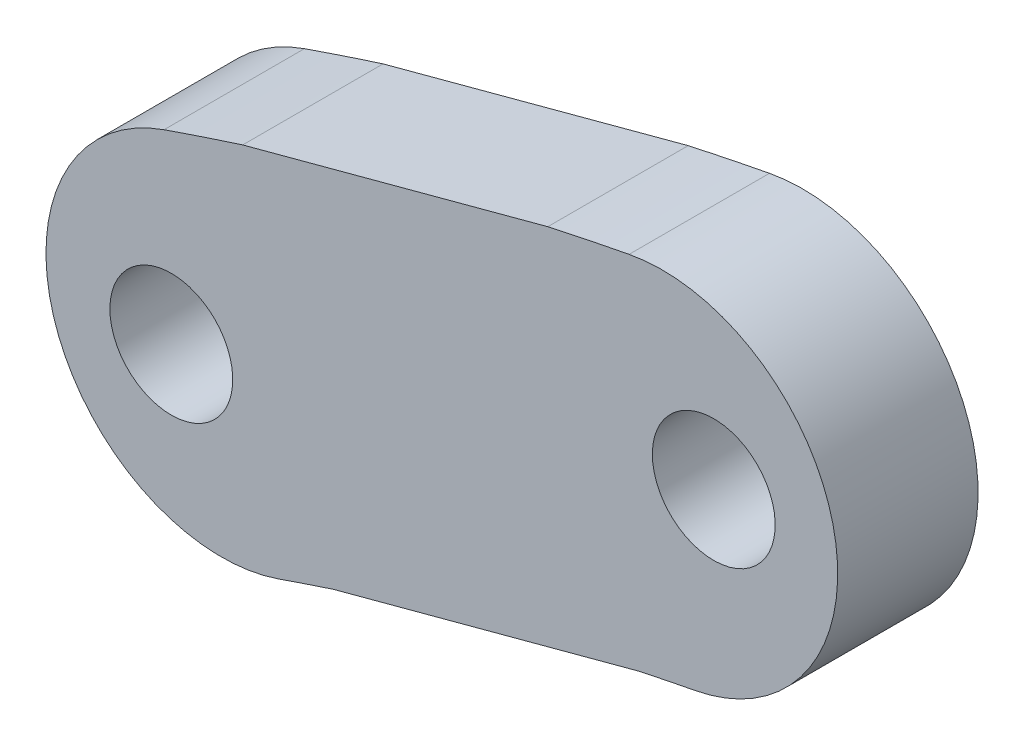
ISO-10303-21;
HEADER;
FILE_DESCRIPTION(('STEP AP214'),'2;1');
FILE_NAME('part.step','',(''),(''),'','','');
FILE_SCHEMA(('AUTOMOTIVE_DESIGN { 1 0 10303 214 1 1 1 1 }'));
ENDSEC;
DATA;
#1=APPLICATION_CONTEXT('core data for automotive mechanical design processes');
#2=APPLICATION_PROTOCOL_DEFINITION('international standard','automotive_design',2000,#1);
#3=PRODUCT_CONTEXT('',#1,'mechanical');
#4=PRODUCT('Part','Part','',(#3));
#5=PRODUCT_RELATED_PRODUCT_CATEGORY('part','',(#4));
#6=PRODUCT_DEFINITION_FORMATION('','',#4);
#7=PRODUCT_DEFINITION_CONTEXT('part definition',#1,'design');
#8=PRODUCT_DEFINITION('design','',#6,#7);
#9=PRODUCT_DEFINITION_SHAPE('','',#8);
#10=(LENGTH_UNIT() NAMED_UNIT(*) SI_UNIT(.MILLI.,.METRE.));
#11=(NAMED_UNIT(*) PLANE_ANGLE_UNIT() SI_UNIT($,.RADIAN.));
#12=(NAMED_UNIT(*) SI_UNIT($,.STERADIAN.) SOLID_ANGLE_UNIT());
#13=UNCERTAINTY_MEASURE_WITH_UNIT(LENGTH_MEASURE(1.E-05),#10,'distance_accuracy_value','');
#14=(GEOMETRIC_REPRESENTATION_CONTEXT(3) GLOBAL_UNCERTAINTY_ASSIGNED_CONTEXT((#13)) GLOBAL_UNIT_ASSIGNED_CONTEXT((#10,
#11,#12)) REPRESENTATION_CONTEXT('',''));
#15=CARTESIAN_POINT('',(0.,0.,0.));
#16=DIRECTION('',(0.,0.,1.));
#17=DIRECTION('',(1.,0.,0.));
#18=AXIS2_PLACEMENT_3D('',#15,#16,#17);
#19=CARTESIAN_POINT('',(-26.4254766264976,81.3053110751052,97.2922710574948));
#20=DIRECTION('',(-0.258819045102521,0.965925826289069,0.));
#21=DIRECTION('',(-0.965925826289069,-0.258819045102521,0.));
#22=AXIS2_PLACEMENT_3D('',#19,#20,#21);
#23=PLANE('',#22);
#24=DIRECTION('',(0.965925826289069,0.258819045102521,0.));
#25=VECTOR('',#24,1.);
#26=CARTESIAN_POINT('',(-26.4254766264976,81.3053110751052,93.2922710574948));
#27=LINE('',#26,#25);
#28=CARTESIAN_POINT('',(-26.4254766264976,81.3053110751052,93.2922710574948));
#29=VERTEX_POINT('',#28);
#30=CARTESIAN_POINT('',(-17.732144189896,83.6346824810279,93.2922710574948));
#31=VERTEX_POINT('',#30);
#32=EDGE_CURVE('E118',#29,#31,#27,.T.);
#33=ORIENTED_EDGE('',*,*,#32,.T.);
#34=DIRECTION('',(0.,0.,-1.));
#35=VECTOR('',#34,1.);
#36=CARTESIAN_POINT('',(-17.732144189896,83.6346824810279,97.2922710574948));
#37=LINE('',#36,#35);
#38=CARTESIAN_POINT('',(-17.732144189896,83.6346824810279,97.2922710574948));
#39=VERTEX_POINT('',#38);
#40=EDGE_CURVE('E11',#39,#31,#37,.T.);
#41=ORIENTED_EDGE('',*,*,#40,.F.);
#42=DIRECTION('',(0.965925826289069,0.258819045102521,0.));
#43=VECTOR('',#42,1.);
#44=CARTESIAN_POINT('',(-26.4254766264976,81.3053110751052,97.2922710574948));
#45=LINE('',#44,#43);
#46=CARTESIAN_POINT('',(-26.4254766264976,81.3053110751052,97.2922710574948));
#47=VERTEX_POINT('',#46);
#48=EDGE_CURVE('E194',#47,#39,#45,.T.);
#49=ORIENTED_EDGE('',*,*,#48,.F.);
#50=DIRECTION('',(0.,0.,-1.));
#51=VECTOR('',#50,1.);
#52=CARTESIAN_POINT('',(-26.4254766264976,81.3053110751052,97.2922710574948));
#53=LINE('',#52,#51);
#54=EDGE_CURVE('E135',#47,#29,#53,.T.);
#55=ORIENTED_EDGE('',*,*,#54,.T.);
#56=EDGE_LOOP('',(#33,#41,#49,#55));
#57=FACE_BOUND('',#56,.T.);
#58=ADVANCED_FACE('F17',(#57),#23,.F.);
#59=CARTESIAN_POINT('',(0.0195470693561329,-0.00219609198103523,97.2922710574948));
#60=DIRECTION('',(0.,0.,-1.));
#61=DIRECTION('',(0.707106781186547,-0.707106781186548,0.));
#62=AXIS2_PLACEMENT_3D('',#59,#60,#61);
#63=CYLINDRICAL_SURFACE('',#62,85.5);
#64=CARTESIAN_POINT('',(0.0195470693561329,-0.00219609198103541,93.2922710574948));
#65=DIRECTION('',(0.,0.,-1.));
#66=DIRECTION('',(0.965925826289068,0.25881904510252,0.));
#67=AXIS2_PLACEMENT_3D('',#64,#65,#66);
#68=CIRCLE('',#67,85.5);
#69=CARTESIAN_POINT('',(-16.120691956258,83.9605497194566,93.2922710574948));
#70=VERTEX_POINT('',#69);
#71=EDGE_CURVE('E121',#31,#70,#68,.T.);
#72=ORIENTED_EDGE('',*,*,#71,.T.);
#73=DIRECTION('',(0.,0.,-1.));
#74=VECTOR('',#73,1.);
#75=CARTESIAN_POINT('',(-16.120691956258,83.9605497194566,97.2922710574948));
#76=LINE('',#75,#74);
#77=CARTESIAN_POINT('',(-16.120691956258,83.9605497194566,97.2922710574948));
#78=VERTEX_POINT('',#77);
#79=EDGE_CURVE('E27',#78,#70,#76,.T.);
#80=ORIENTED_EDGE('',*,*,#79,.F.);
#81=CARTESIAN_POINT('',(0.0195470693561329,-0.00219609198103523,97.2922710574948));
#82=DIRECTION('',(0.,0.,-1.));
#83=DIRECTION('',(0.965925826289068,0.25881904510252,0.));
#84=AXIS2_PLACEMENT_3D('',#81,#82,#83);
#85=CIRCLE('',#84,85.5);
#86=EDGE_CURVE('E195',#39,#78,#85,.T.);
#87=ORIENTED_EDGE('',*,*,#86,.F.);
#88=ORIENTED_EDGE('',*,*,#40,.T.);
#89=EDGE_LOOP('',(#72,#80,#87,#88));
#90=FACE_BOUND('',#89,.T.);
#91=ADVANCED_FACE('F166',(#90),#63,.F.);
#92=CARTESIAN_POINT('',(-17.0645655833726,88.8706518137498,97.2922710574948));
#93=DIRECTION('',(0.,0.,-1.));
#94=DIRECTION('',(0.707106781186547,-0.707106781186548,0.));
#95=AXIS2_PLACEMENT_3D('',#92,#93,#94);
#96=CYLINDRICAL_SURFACE('',#95,5.);
#97=CARTESIAN_POINT('',(-17.0645655833726,88.8706518137498,93.2922710574948));
#98=DIRECTION('',(0.,0.,1.));
#99=DIRECTION('',(0.965925826289068,0.25881904510252,0.));
#100=AXIS2_PLACEMENT_3D('',#97,#98,#99);
#101=CIRCLE('',#100,5.);
#102=CARTESIAN_POINT('',(-18.008439210595,93.7807539079872,93.2922710574948));
#103=VERTEX_POINT('',#102);
#104=EDGE_CURVE('E123',#70,#103,#101,.T.);
#105=ORIENTED_EDGE('',*,*,#104,.T.);
#106=DIRECTION('',(0.,0.,-1.));
#107=VECTOR('',#106,1.);
#108=CARTESIAN_POINT('',(-18.008439210595,93.7807539079872,97.2922710574948));
#109=LINE('',#108,#107);
#110=CARTESIAN_POINT('',(-18.008439210595,93.7807539079872,97.2922710574948));
#111=VERTEX_POINT('',#110);
#112=EDGE_CURVE('E138',#111,#103,#109,.T.);
#113=ORIENTED_EDGE('',*,*,#112,.F.);
#114=CARTESIAN_POINT('',(-17.0645655833726,88.8706518137498,97.2922710574948));
#115=DIRECTION('',(0.,0.,1.));
#116=DIRECTION('',(0.965925826289068,0.25881904510252,0.));
#117=AXIS2_PLACEMENT_3D('',#114,#115,#116);
#118=CIRCLE('',#117,5.);
#119=EDGE_CURVE('E199',#78,#111,#118,.T.);
#120=ORIENTED_EDGE('',*,*,#119,.F.);
#121=ORIENTED_EDGE('',*,*,#79,.T.);
#122=EDGE_LOOP('',(#105,#113,#120,#121));
#123=FACE_BOUND('',#122,.T.);
#124=ADVANCED_FACE('F172',(#123),#96,.T.);
#125=CARTESIAN_POINT('',(0.0195470693557388,-0.00219609197978396,97.2922710574948));
#126=DIRECTION('',(0.,0.,-1.));
#127=DIRECTION('',(0.707106781186547,-0.707106781186548,0.));
#128=AXIS2_PLACEMENT_3D('',#125,#126,#127);
#129=CYLINDRICAL_SURFACE('',#128,95.5);
#130=CARTESIAN_POINT('',(0.0195470693557389,-0.0021960919797841,93.2922710574948));
#131=DIRECTION('',(0.,0.,1.));
#132=DIRECTION('',(0.965925826289068,0.25881904510252,0.));
#133=AXIS2_PLACEMENT_3D('',#130,#131,#132);
#134=CIRCLE('',#133,95.5);
#135=CARTESIAN_POINT('',(-20.3235500320025,93.3059407468003,93.2922710574948));
#136=VERTEX_POINT('',#135);
#137=EDGE_CURVE('E125',#103,#136,#134,.T.);
#138=ORIENTED_EDGE('',*,*,#137,.T.);
#139=DIRECTION('',(0.,0.,-1.));
#140=VECTOR('',#139,1.);
#141=CARTESIAN_POINT('',(-20.3235500320025,93.3059407468003,97.2922710574948));
#142=LINE('',#141,#140);
#143=CARTESIAN_POINT('',(-20.3235500320025,93.3059407468003,97.2922710574948));
#144=VERTEX_POINT('',#143);
#145=EDGE_CURVE('E108',#144,#136,#142,.T.);
#146=ORIENTED_EDGE('',*,*,#145,.F.);
#147=CARTESIAN_POINT('',(0.0195470693557388,-0.00219609197978396,97.2922710574948));
#148=DIRECTION('',(0.,0.,1.));
#149=DIRECTION('',(0.965925826289068,0.25881904510252,0.));
#150=AXIS2_PLACEMENT_3D('',#147,#148,#149);
#151=CIRCLE('',#150,95.5);
#152=EDGE_CURVE('E99',#111,#144,#151,.T.);
#153=ORIENTED_EDGE('',*,*,#152,.F.);
#154=ORIENTED_EDGE('',*,*,#112,.T.);
#155=EDGE_LOOP('',(#138,#146,#153,#154));
#156=FACE_BOUND('',#155,.T.);
#157=ADVANCED_FACE('F209',(#156),#129,.T.);
#158=CARTESIAN_POINT('',(-20.3235500320025,93.3059407468003,97.2922710574948));
#159=DIRECTION('',(0.25881904510252,-0.965925826289068,0.));
#160=DIRECTION('',(0.965925826289068,0.25881904510252,0.));
#161=AXIS2_PLACEMENT_3D('',#158,#159,#160);
#162=PLANE('',#161);
#163=DIRECTION('',(-0.965925826289068,-0.25881904510252,0.));
#164=VECTOR('',#163,1.);
#165=CARTESIAN_POINT('',(-20.3235500320025,93.3059407468003,93.2922710574948));
#166=LINE('',#165,#164);
#167=CARTESIAN_POINT('',(-29.0168824686041,90.9765693408776,93.2922710574948));
#168=VERTEX_POINT('',#167);
#169=EDGE_CURVE('E107',#136,#168,#166,.T.);
#170=ORIENTED_EDGE('',*,*,#169,.T.);
#171=DIRECTION('',(0.,0.,-1.));
#172=VECTOR('',#171,1.);
#173=CARTESIAN_POINT('',(-29.0168824686041,90.9765693408776,97.2922710574948));
#174=LINE('',#173,#172);
#175=CARTESIAN_POINT('',(-29.0168824686041,90.9765693408776,97.2922710574948));
#176=VERTEX_POINT('',#175);
#177=EDGE_CURVE('E104',#176,#168,#174,.T.);
#178=ORIENTED_EDGE('',*,*,#177,.F.);
#179=DIRECTION('',(-0.965925826289068,-0.25881904510252,0.));
#180=VECTOR('',#179,1.);
#181=CARTESIAN_POINT('',(-20.3235500320025,93.3059407468003,97.2922710574948));
#182=LINE('',#181,#180);
#183=EDGE_CURVE('E92',#144,#176,#182,.T.);
#184=ORIENTED_EDGE('',*,*,#183,.F.);
#185=ORIENTED_EDGE('',*,*,#145,.T.);
#186=EDGE_LOOP('',(#170,#178,#184,#185));
#187=FACE_BOUND('',#186,.T.);
#188=ADVANCED_FACE('F105',(#187),#162,.F.);
#189=CARTESIAN_POINT('',(0.0195470693557388,-0.00219609197978396,97.2922710574948));
#190=DIRECTION('',(0.,0.,-1.));
#191=DIRECTION('',(0.707106781186547,-0.707106781186548,0.));
#192=AXIS2_PLACEMENT_3D('',#189,#190,#191);
#193=CYLINDRICAL_SURFACE('',#192,95.5);
#194=CARTESIAN_POINT('',(0.0195470693557389,-0.0021960919797841,93.2922710574948));
#195=DIRECTION('',(0.,0.,1.));
#196=DIRECTION('',(0.965925826289068,0.25881904510252,0.));
#197=AXIS2_PLACEMENT_3D('',#194,#195,#196);
#198=CIRCLE('',#197,95.5);
#199=CARTESIAN_POINT('',(-31.2592338331038,90.2302141897795,93.2922710574948));
#200=VERTEX_POINT('',#199);
#201=EDGE_CURVE('E65',#168,#200,#198,.T.);
#202=ORIENTED_EDGE('',*,*,#201,.T.);
#203=DIRECTION('',(0.,0.,-1.));
#204=VECTOR('',#203,1.);
#205=CARTESIAN_POINT('',(-31.2592338331038,90.2302141897795,97.2922710574948));
#206=LINE('',#205,#204);
#207=CARTESIAN_POINT('',(-31.2592338331038,90.2302141897795,97.2922710574948));
#208=VERTEX_POINT('',#207);
#209=EDGE_CURVE('E109',#208,#200,#206,.T.);
#210=ORIENTED_EDGE('',*,*,#209,.F.);
#211=CARTESIAN_POINT('',(0.0195470693557388,-0.00219609197978396,97.2922710574948));
#212=DIRECTION('',(0.,0.,1.));
#213=DIRECTION('',(0.965925826289068,0.25881904510252,0.));
#214=AXIS2_PLACEMENT_3D('',#211,#212,#213);
#215=CIRCLE('',#214,95.5);
#216=EDGE_CURVE('E97',#176,#208,#215,.T.);
#217=ORIENTED_EDGE('',*,*,#216,.F.);
#218=ORIENTED_EDGE('',*,*,#177,.T.);
#219=EDGE_LOOP('',(#202,#210,#217,#218));
#220=FACE_BOUND('',#219,.T.);
#221=ADVANCED_FACE('F111',(#220),#193,.T.);
#222=CARTESIAN_POINT('',(-29.6216013251217,85.5060042273846,97.2922710574948));
#223=DIRECTION('',(0.,0.,-1.));
#224=DIRECTION('',(0.707106781186547,-0.707106781186548,0.));
#225=AXIS2_PLACEMENT_3D('',#222,#223,#224);
#226=CYLINDRICAL_SURFACE('',#225,5.);
#227=CARTESIAN_POINT('',(-29.6216013251217,85.5060042273846,93.2922710574948));
#228=DIRECTION('',(0.,0.,1.));
#229=DIRECTION('',(0.965925826289068,0.25881904510252,0.));
#230=AXIS2_PLACEMENT_3D('',#227,#228,#229);
#231=CIRCLE('',#230,5.);
#232=CARTESIAN_POINT('',(-27.9839688171397,80.7817942649888,93.2922710574948));
#233=VERTEX_POINT('',#232);
#234=EDGE_CURVE('E71',#200,#233,#231,.T.);
#235=ORIENTED_EDGE('',*,*,#234,.T.);
#236=DIRECTION('',(0.,0.,-1.));
#237=VECTOR('',#236,1.);
#238=CARTESIAN_POINT('',(-27.9839688171397,80.7817942649888,97.2922710574948));
#239=LINE('',#238,#237);
#240=CARTESIAN_POINT('',(-27.9839688171397,80.7817942649888,97.2922710574948));
#241=VERTEX_POINT('',#240);
#242=EDGE_CURVE('E133',#241,#233,#239,.T.);
#243=ORIENTED_EDGE('',*,*,#242,.F.);
#244=CARTESIAN_POINT('',(-29.6216013251217,85.5060042273846,97.2922710574948));
#245=DIRECTION('',(0.,0.,1.));
#246=DIRECTION('',(0.965925826289068,0.25881904510252,0.));
#247=AXIS2_PLACEMENT_3D('',#244,#245,#246);
#248=CIRCLE('',#247,5.);
#249=EDGE_CURVE('E36',#208,#241,#248,.T.);
#250=ORIENTED_EDGE('',*,*,#249,.F.);
#251=ORIENTED_EDGE('',*,*,#209,.T.);
#252=EDGE_LOOP('',(#235,#243,#250,#251));
#253=FACE_BOUND('',#252,.T.);
#254=ADVANCED_FACE('F178',(#253),#226,.T.);
#255=CARTESIAN_POINT('',(-31.0504104471595,85.0428375074125,97.2922710574948));
#256=DIRECTION('',(0.,0.,-1.));
#257=DIRECTION('',(0.707106781186547,-0.707106781186548,0.));
#258=AXIS2_PLACEMENT_3D('',#255,#256,#257);
#259=CYLINDRICAL_SURFACE('',#258,1.75);
#260=CARTESIAN_POINT('',(-31.0504104471595,85.0428375074125,97.2922710574948));
#261=DIRECTION('',(0.,0.,1.));
#262=DIRECTION('',(0.25881904510252,-0.965925826289068,0.));
#263=AXIS2_PLACEMENT_3D('',#260,#261,#262);
#264=CIRCLE('',#263,1.75);
#265=CARTESIAN_POINT('',(-30.5974771182301,83.3524673114066,97.2922710574948));
#266=VERTEX_POINT('',#265);
#267=EDGE_CURVE('E117',#266,#266,#264,.T.);
#268=ORIENTED_EDGE('',*,*,#267,.T.);
#269=EDGE_LOOP('',(#268));
#270=FACE_BOUND('',#269,.T.);
#271=CARTESIAN_POINT('',(-31.0504104471595,85.0428375074125,93.2922710574948));
#272=DIRECTION('',(0.,0.,1.));
#273=DIRECTION('',(0.25881904510252,-0.965925826289068,0.));
#274=AXIS2_PLACEMENT_3D('',#271,#272,#273);
#275=CIRCLE('',#274,1.75);
#276=CARTESIAN_POINT('',(-30.5974771182301,83.3524673114066,93.2922710574948));
#277=VERTEX_POINT('',#276);
#278=EDGE_CURVE('E132',#277,#277,#275,.T.);
#279=ORIENTED_EDGE('',*,*,#278,.F.);
#280=EDGE_LOOP('',(#279));
#281=FACE_BOUND('',#280,.T.);
#282=ADVANCED_FACE('F176',(#270,#281),#259,.F.);
#283=CARTESIAN_POINT('',(0.0195470693561329,-0.00219609198103523,97.2922710574948));
#284=DIRECTION('',(0.,0.,-1.));
#285=DIRECTION('',(0.707106781186547,-0.707106781186548,0.));
#286=AXIS2_PLACEMENT_3D('',#283,#284,#285);
#287=CYLINDRICAL_SURFACE('',#286,85.5);
#288=CARTESIAN_POINT('',(0.0195470693561329,-0.00219609198103541,93.2922710574948));
#289=DIRECTION('',(0.,0.,-1.));
#290=DIRECTION('',(0.965925826289068,0.25881904510252,0.));
#291=AXIS2_PLACEMENT_3D('',#288,#289,#290);
#292=CIRCLE('',#291,85.5);
#293=EDGE_CURVE('E130',#233,#29,#292,.T.);
#294=ORIENTED_EDGE('',*,*,#293,.T.);
#295=ORIENTED_EDGE('',*,*,#54,.F.);
#296=CARTESIAN_POINT('',(0.0195470693561329,-0.00219609198103523,97.2922710574948));
#297=DIRECTION('',(0.,0.,-1.));
#298=DIRECTION('',(0.965925826289068,0.25881904510252,0.));
#299=AXIS2_PLACEMENT_3D('',#296,#297,#298);
#300=CIRCLE('',#299,85.5);
#301=EDGE_CURVE('E77',#241,#47,#300,.T.);
#302=ORIENTED_EDGE('',*,*,#301,.F.);
#303=ORIENTED_EDGE('',*,*,#242,.T.);
#304=EDGE_LOOP('',(#294,#295,#302,#303));
#305=FACE_BOUND('',#304,.T.);
#306=ADVANCED_FACE('F164',(#305),#287,.F.);
#307=CARTESIAN_POINT('',(-15.5955972265344,89.1839422290527,97.2922710574948));
#308=DIRECTION('',(0.,0.,-1.));
#309=DIRECTION('',(0.707106781186547,-0.707106781186548,0.));
#310=AXIS2_PLACEMENT_3D('',#307,#308,#309);
#311=CYLINDRICAL_SURFACE('',#310,1.75);
#312=CARTESIAN_POINT('',(-15.5955972265344,89.1839422290527,97.2922710574948));
#313=DIRECTION('',(0.,0.,1.));
#314=DIRECTION('',(0.25881904510252,-0.965925826289068,0.));
#315=AXIS2_PLACEMENT_3D('',#312,#313,#314);
#316=CIRCLE('',#315,1.75);
#317=CARTESIAN_POINT('',(-15.142663897605,87.4935720330468,97.2922710574948));
#318=VERTEX_POINT('',#317);
#319=EDGE_CURVE('E145',#318,#318,#316,.T.);
#320=ORIENTED_EDGE('',*,*,#319,.T.);
#321=EDGE_LOOP('',(#320));
#322=FACE_BOUND('',#321,.T.);
#323=CARTESIAN_POINT('',(-15.5955972265344,89.1839422290527,93.2922710574948));
#324=DIRECTION('',(0.,0.,1.));
#325=DIRECTION('',(0.25881904510252,-0.965925826289068,0.));
#326=AXIS2_PLACEMENT_3D('',#323,#324,#325);
#327=CIRCLE('',#326,1.75);
#328=CARTESIAN_POINT('',(-15.142663897605,87.4935720330468,93.2922710574948));
#329=VERTEX_POINT('',#328);
#330=EDGE_CURVE('E21',#329,#329,#327,.T.);
#331=ORIENTED_EDGE('',*,*,#330,.F.);
#332=EDGE_LOOP('',(#331));
#333=FACE_BOUND('',#332,.T.);
#334=ADVANCED_FACE('F19',(#322,#333),#311,.F.);
#335=CARTESIAN_POINT('',(0.0195470693561329,-0.00219609198103523,97.2922710574948));
#336=DIRECTION('',(0.,0.,-1.));
#337=DIRECTION('',(0.707106781186548,0.707106781186547,0.));
#338=AXIS2_PLACEMENT_3D('',#335,#336,#337);
#339=PLANE('',#338);
#340=ORIENTED_EDGE('',*,*,#48,.T.);
#341=ORIENTED_EDGE('',*,*,#86,.T.);
#342=ORIENTED_EDGE('',*,*,#119,.T.);
#343=ORIENTED_EDGE('',*,*,#152,.T.);
#344=ORIENTED_EDGE('',*,*,#183,.T.);
#345=ORIENTED_EDGE('',*,*,#216,.T.);
#346=ORIENTED_EDGE('',*,*,#249,.T.);
#347=ORIENTED_EDGE('',*,*,#301,.T.);
#348=EDGE_LOOP('',(#340,#341,#342,#343,#344,#345,#346,#347));
#349=FACE_BOUND('',#348,.T.);
#350=ORIENTED_EDGE('',*,*,#267,.F.);
#351=EDGE_LOOP('',(#350));
#352=FACE_BOUND('',#351,.T.);
#353=ORIENTED_EDGE('',*,*,#319,.F.);
#354=EDGE_LOOP('',(#353));
#355=FACE_BOUND('',#354,.T.);
#356=ADVANCED_FACE('F94',(#349,#352,#355),#339,.F.);
#357=CARTESIAN_POINT('',(0.0195470693561329,-0.00219609198103541,93.2922710574948));
#358=DIRECTION('',(0.,0.,-1.));
#359=DIRECTION('',(0.707106781186548,0.707106781186547,0.));
#360=AXIS2_PLACEMENT_3D('',#357,#358,#359);
#361=PLANE('',#360);
#362=ORIENTED_EDGE('',*,*,#32,.F.);
#363=ORIENTED_EDGE('',*,*,#293,.F.);
#364=ORIENTED_EDGE('',*,*,#234,.F.);
#365=ORIENTED_EDGE('',*,*,#201,.F.);
#366=ORIENTED_EDGE('',*,*,#169,.F.);
#367=ORIENTED_EDGE('',*,*,#137,.F.);
#368=ORIENTED_EDGE('',*,*,#104,.F.);
#369=ORIENTED_EDGE('',*,*,#71,.F.);
#370=EDGE_LOOP('',(#362,#363,#364,#365,#366,#367,#368,#369));
#371=FACE_BOUND('',#370,.T.);
#372=ORIENTED_EDGE('',*,*,#278,.T.);
#373=EDGE_LOOP('',(#372));
#374=FACE_BOUND('',#373,.T.);
#375=ORIENTED_EDGE('',*,*,#330,.T.);
#376=EDGE_LOOP('',(#375));
#377=FACE_BOUND('',#376,.T.);
#378=ADVANCED_FACE('F155',(#371,#374,#377),#361,.T.);
#379=CLOSED_SHELL('',(#58,#91,#124,#157,#188,#221,#254,#282,#306,#334,#356,#378));
#380=MANIFOLD_SOLID_BREP('B1',#379);
#381=ADVANCED_BREP_SHAPE_REPRESENTATION('',(#18,#380),#14);
#382=SHAPE_DEFINITION_REPRESENTATION(#9,#381);
ENDSEC;
END-ISO-10303-21;
